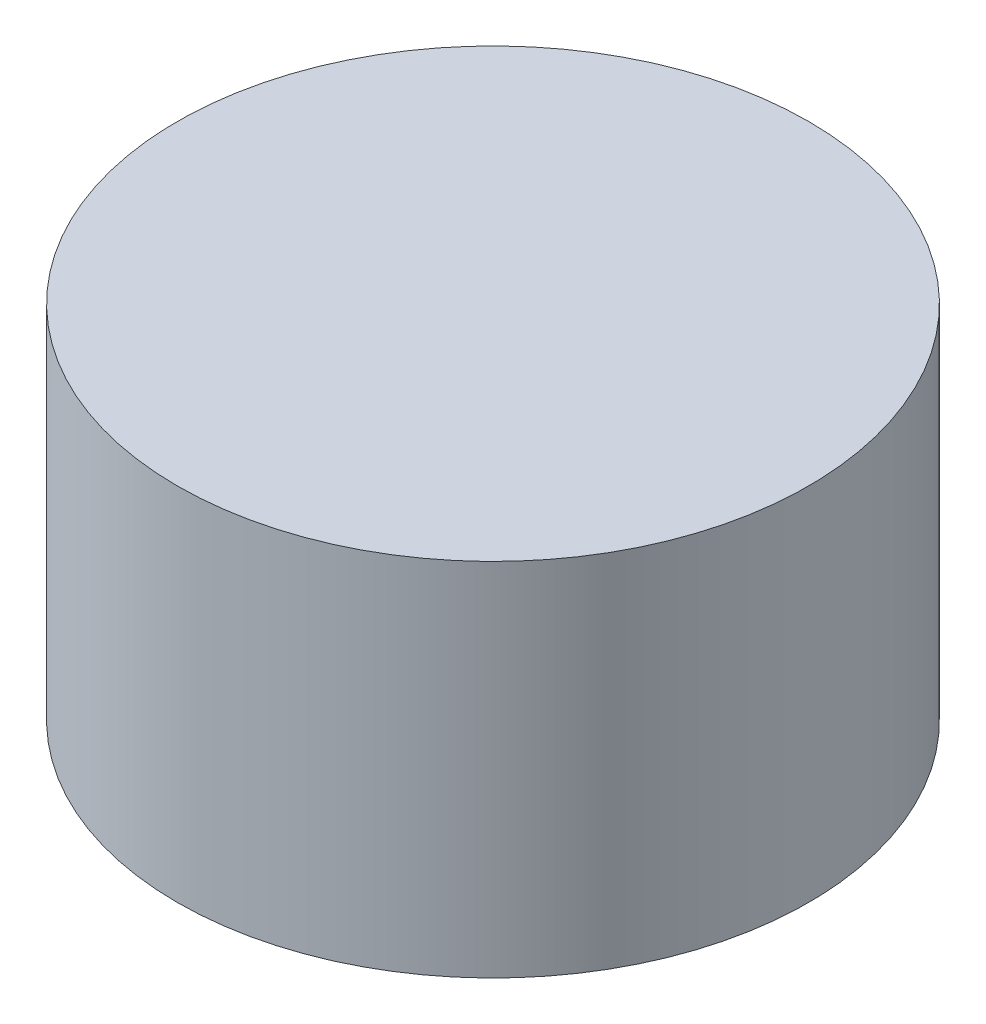
ISO-10303-21;
HEADER;
FILE_DESCRIPTION(('STEP AP214'),'2;1');
FILE_NAME('part.step','',(''),(''),'','','');
FILE_SCHEMA(('AUTOMOTIVE_DESIGN { 1 0 10303 214 1 1 1 1 }'));
ENDSEC;
DATA;
#1=APPLICATION_CONTEXT('core data for automotive mechanical design processes');
#2=APPLICATION_PROTOCOL_DEFINITION('international standard','automotive_design',2000,#1);
#3=PRODUCT_CONTEXT('',#1,'mechanical');
#4=PRODUCT('Part','Part','',(#3));
#5=PRODUCT_RELATED_PRODUCT_CATEGORY('part','',(#4));
#6=PRODUCT_DEFINITION_FORMATION('','',#4);
#7=PRODUCT_DEFINITION_CONTEXT('part definition',#1,'design');
#8=PRODUCT_DEFINITION('design','',#6,#7);
#9=PRODUCT_DEFINITION_SHAPE('','',#8);
#10=(LENGTH_UNIT() NAMED_UNIT(*) SI_UNIT(.MILLI.,.METRE.));
#11=(NAMED_UNIT(*) PLANE_ANGLE_UNIT() SI_UNIT($,.RADIAN.));
#12=(NAMED_UNIT(*) SI_UNIT($,.STERADIAN.) SOLID_ANGLE_UNIT());
#13=UNCERTAINTY_MEASURE_WITH_UNIT(LENGTH_MEASURE(1.E-05),#10,'distance_accuracy_value','');
#14=(GEOMETRIC_REPRESENTATION_CONTEXT(3) GLOBAL_UNCERTAINTY_ASSIGNED_CONTEXT((#13)) GLOBAL_UNIT_ASSIGNED_CONTEXT((#10,
#11,#12)) REPRESENTATION_CONTEXT('',''));
#15=CARTESIAN_POINT('',(0.,0.,0.));
#16=DIRECTION('',(0.,0.,1.));
#17=DIRECTION('',(1.,0.,0.));
#18=AXIS2_PLACEMENT_3D('',#15,#16,#17);
#19=CARTESIAN_POINT('',(0.,0.,0.));
#20=DIRECTION('',(0.,1.,0.));
#21=DIRECTION('',(0.,0.,1.));
#22=AXIS2_PLACEMENT_3D('',#19,#20,#21);
#23=PLANE('',#22);
#24=CARTESIAN_POINT('',(0.,0.,0.));
#25=DIRECTION('',(0.,-1.,0.));
#26=DIRECTION('',(0.,0.,-1.));
#27=AXIS2_PLACEMENT_3D('',#24,#25,#26);
#28=CIRCLE('',#27,22.225);
#29=CARTESIAN_POINT('',(0.,0.,-22.225));
#30=VERTEX_POINT('',#29);
#31=EDGE_CURVE('E10',#30,#30,#28,.T.);
#32=ORIENTED_EDGE('',*,*,#31,.T.);
#33=EDGE_LOOP('',(#32));
#34=FACE_BOUND('',#33,.T.);
#35=ADVANCED_FACE('F37',(#34),#23,.F.);
#36=CARTESIAN_POINT('',(0.,0.,0.));
#37=DIRECTION('',(0.,-1.,0.));
#38=DIRECTION('',(0.,0.,-1.));
#39=AXIS2_PLACEMENT_3D('',#36,#37,#38);
#40=CYLINDRICAL_SURFACE('',#39,22.225);
#41=ORIENTED_EDGE('',*,*,#31,.F.);
#42=EDGE_LOOP('',(#41));
#43=FACE_BOUND('',#42,.T.);
#44=CARTESIAN_POINT('',(0.,25.4,0.));
#45=DIRECTION('',(0.,-1.,0.));
#46=DIRECTION('',(0.,0.,-1.));
#47=AXIS2_PLACEMENT_3D('',#44,#45,#46);
#48=CIRCLE('',#47,22.225);
#49=CARTESIAN_POINT('',(0.,25.4,-22.225));
#50=VERTEX_POINT('',#49);
#51=EDGE_CURVE('E44',#50,#50,#48,.T.);
#52=ORIENTED_EDGE('',*,*,#51,.T.);
#53=EDGE_LOOP('',(#52));
#54=FACE_BOUND('',#53,.T.);
#55=ADVANCED_FACE('F51',(#43,#54),#40,.T.);
#56=CARTESIAN_POINT('',(-22.225,25.4,0.));
#57=DIRECTION('',(0.,-1.,0.));
#58=DIRECTION('',(0.,0.,-1.));
#59=AXIS2_PLACEMENT_3D('',#56,#57,#58);
#60=PLANE('',#59);
#61=ORIENTED_EDGE('',*,*,#51,.F.);
#62=EDGE_LOOP('',(#61));
#63=FACE_BOUND('',#62,.T.);
#64=ADVANCED_FACE('F53',(#63),#60,.F.);
#65=CLOSED_SHELL('',(#35,#55,#64));
#66=MANIFOLD_SOLID_BREP('B2',#65);
#67=ADVANCED_BREP_SHAPE_REPRESENTATION('',(#18,#66),#14);
#68=SHAPE_DEFINITION_REPRESENTATION(#9,#67);
ENDSEC;
END-ISO-10303-21;
